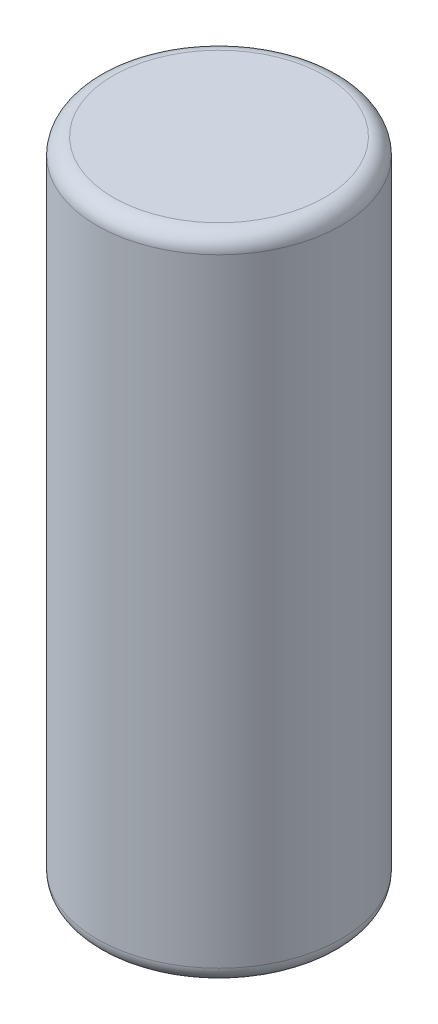
ISO-10303-21;
HEADER;
FILE_DESCRIPTION(('STEP AP214'),'2;1');
FILE_NAME('part.step','',(''),(''),'','','');
FILE_SCHEMA(('AUTOMOTIVE_DESIGN { 1 0 10303 214 1 1 1 1 }'));
ENDSEC;
DATA;
#1=APPLICATION_CONTEXT('core data for automotive mechanical design processes');
#2=APPLICATION_PROTOCOL_DEFINITION('international standard','automotive_design',2000,#1);
#3=PRODUCT_CONTEXT('',#1,'mechanical');
#4=PRODUCT('Part','Part','',(#3));
#5=PRODUCT_RELATED_PRODUCT_CATEGORY('part','',(#4));
#6=PRODUCT_DEFINITION_FORMATION('','',#4);
#7=PRODUCT_DEFINITION_CONTEXT('part definition',#1,'design');
#8=PRODUCT_DEFINITION('design','',#6,#7);
#9=PRODUCT_DEFINITION_SHAPE('','',#8);
#10=(LENGTH_UNIT() NAMED_UNIT(*) SI_UNIT(.MILLI.,.METRE.));
#11=(NAMED_UNIT(*) PLANE_ANGLE_UNIT() SI_UNIT($,.RADIAN.));
#12=(NAMED_UNIT(*) SI_UNIT($,.STERADIAN.) SOLID_ANGLE_UNIT());
#13=UNCERTAINTY_MEASURE_WITH_UNIT(LENGTH_MEASURE(1.E-05),#10,'distance_accuracy_value','');
#14=(GEOMETRIC_REPRESENTATION_CONTEXT(3) GLOBAL_UNCERTAINTY_ASSIGNED_CONTEXT((#13)) GLOBAL_UNIT_ASSIGNED_CONTEXT((#10,
#11,#12)) REPRESENTATION_CONTEXT('',''));
#15=CARTESIAN_POINT('',(0.,0.,0.));
#16=DIRECTION('',(0.,0.,1.));
#17=DIRECTION('',(1.,0.,0.));
#18=AXIS2_PLACEMENT_3D('',#15,#16,#17);
#19=CARTESIAN_POINT('',(0.,400.,0.));
#20=DIRECTION('',(0.,-1.,0.));
#21=DIRECTION('',(0.,0.,-1.));
#22=AXIS2_PLACEMENT_3D('',#19,#20,#21);
#23=CYLINDRICAL_SURFACE('',#22,75.);
#24=CARTESIAN_POINT('',(0.,10.,0.));
#25=DIRECTION('',(0.,1.,0.));
#26=DIRECTION('',(0.,0.,1.));
#27=AXIS2_PLACEMENT_3D('',#24,#25,#26);
#28=CIRCLE('',#27,75.);
#29=CARTESIAN_POINT('',(0.,10.,-75.));
#30=VERTEX_POINT('',#29);
#31=EDGE_CURVE('E44',#30,#30,#28,.T.);
#32=CARTESIAN_POINT('',(0.,390.,0.));
#33=DIRECTION('',(0.,1.,0.));
#34=DIRECTION('',(0.,0.,1.));
#35=AXIS2_PLACEMENT_3D('',#32,#33,#34);
#36=CIRCLE('',#35,75.);
#37=CARTESIAN_POINT('',(0.,390.,-75.));
#38=VERTEX_POINT('',#37);
#39=EDGE_CURVE('E48',#38,#38,#36,.F.);
#40=CARTESIAN_POINT('',(0.,10.,-75.));
#41=CARTESIAN_POINT('',(0.,13.9583333333333,-75.));
#42=CARTESIAN_POINT('',(0.,17.9166666666667,-75.));
#43=CARTESIAN_POINT('',(0.,25.8333333333334,-75.));
#44=CARTESIAN_POINT('',(0.,29.7916666666667,-75.));
#45=CARTESIAN_POINT('',(0.,37.7083333333333,-75.));
#46=CARTESIAN_POINT('',(0.,41.6666666666667,-75.));
#47=CARTESIAN_POINT('',(0.,49.5833333333334,-75.));
#48=CARTESIAN_POINT('',(0.,53.5416666666667,-75.));
#49=CARTESIAN_POINT('',(0.,61.4583333333334,-75.));
#50=CARTESIAN_POINT('',(0.,65.4166666666667,-75.));
#51=CARTESIAN_POINT('',(0.,73.3333333333334,-75.));
#52=CARTESIAN_POINT('',(0.,77.2916666666667,-75.));
#53=CARTESIAN_POINT('',(0.,85.2083333333334,-75.));
#54=CARTESIAN_POINT('',(0.,89.1666666666667,-75.));
#55=CARTESIAN_POINT('',(0.,97.0833333333334,-75.));
#56=CARTESIAN_POINT('',(0.,101.041666666667,-75.));
#57=CARTESIAN_POINT('',(0.,108.958333333333,-75.));
#58=CARTESIAN_POINT('',(0.,112.916666666667,-75.));
#59=CARTESIAN_POINT('',(0.,120.833333333333,-75.));
#60=CARTESIAN_POINT('',(0.,124.791666666667,-75.));
#61=CARTESIAN_POINT('',(0.,132.708333333333,-75.));
#62=CARTESIAN_POINT('',(0.,136.666666666667,-75.));
#63=CARTESIAN_POINT('',(0.,144.583333333333,-75.));
#64=CARTESIAN_POINT('',(0.,148.541666666667,-75.));
#65=CARTESIAN_POINT('',(0.,156.458333333333,-75.));
#66=CARTESIAN_POINT('',(0.,160.416666666667,-75.));
#67=CARTESIAN_POINT('',(0.,168.333333333333,-75.));
#68=CARTESIAN_POINT('',(0.,172.291666666667,-75.));
#69=CARTESIAN_POINT('',(0.,180.208333333333,-75.));
#70=CARTESIAN_POINT('',(0.,184.166666666667,-75.));
#71=CARTESIAN_POINT('',(0.,192.083333333333,-75.));
#72=CARTESIAN_POINT('',(0.,196.041666666667,-75.));
#73=CARTESIAN_POINT('',(0.,203.958333333333,-75.));
#74=CARTESIAN_POINT('',(0.,207.916666666667,-75.));
#75=CARTESIAN_POINT('',(0.,215.833333333333,-75.));
#76=CARTESIAN_POINT('',(0.,219.791666666667,-75.));
#77=CARTESIAN_POINT('',(0.,227.708333333333,-75.));
#78=CARTESIAN_POINT('',(0.,231.666666666667,-75.));
#79=CARTESIAN_POINT('',(0.,239.583333333333,-75.));
#80=CARTESIAN_POINT('',(0.,243.541666666667,-75.));
#81=CARTESIAN_POINT('',(0.,251.458333333333,-75.));
#82=CARTESIAN_POINT('',(0.,255.416666666667,-75.));
#83=CARTESIAN_POINT('',(0.,263.333333333333,-75.));
#84=CARTESIAN_POINT('',(0.,267.291666666667,-75.));
#85=CARTESIAN_POINT('',(0.,275.208333333333,-75.));
#86=CARTESIAN_POINT('',(0.,279.166666666667,-75.));
#87=CARTESIAN_POINT('',(0.,287.083333333333,-75.));
#88=CARTESIAN_POINT('',(0.,291.041666666667,-75.));
#89=CARTESIAN_POINT('',(0.,298.958333333333,-75.));
#90=CARTESIAN_POINT('',(0.,302.916666666667,-75.));
#91=CARTESIAN_POINT('',(0.,310.833333333333,-75.));
#92=CARTESIAN_POINT('',(0.,314.791666666667,-75.));
#93=CARTESIAN_POINT('',(0.,322.708333333333,-75.));
#94=CARTESIAN_POINT('',(0.,326.666666666667,-75.));
#95=CARTESIAN_POINT('',(0.,334.583333333333,-75.));
#96=CARTESIAN_POINT('',(0.,338.541666666667,-75.));
#97=CARTESIAN_POINT('',(0.,346.458333333333,-75.));
#98=CARTESIAN_POINT('',(0.,350.416666666667,-75.));
#99=CARTESIAN_POINT('',(0.,358.333333333333,-75.));
#100=CARTESIAN_POINT('',(0.,362.291666666667,-75.));
#101=CARTESIAN_POINT('',(0.,370.208333333334,-75.));
#102=CARTESIAN_POINT('',(0.,374.166666666667,-75.));
#103=CARTESIAN_POINT('',(0.,382.083333333333,-75.));
#104=CARTESIAN_POINT('',(0.,386.041666666667,-75.));
#105=CARTESIAN_POINT('',(0.,390.,-75.));
#106=B_SPLINE_CURVE_WITH_KNOTS('',3,(#40,#41,#42,#43,#44,#45,#46,#47,#48,#49,#50,#51,#52,#53,
#54,#55,#56,#57,#58,#59,#60,#61,#62,#63,#64,#65,#66,#67,#68,#69,#70,#71,#72,#73,#74,#75,#76,#77,
#78,#79,#80,#81,#82,#83,#84,#85,#86,#87,#88,#89,#90,#91,#92,#93,#94,#95,#96,#97,#98,#99,#100,
#101,#102,#103,#104,#105),.UNSPECIFIED.,.F.,.F.,(4,2,2,2,2,2,2,2,2,2,2,2,2,2,2,2,2,2,2,2,2,2,2,
2,2,2,2,2,2,2,2,2,4),(0.,11.875,23.75,35.625,47.5,59.3750000000001,71.25,83.1250000000001,
95.0000000000001,106.875,118.75,130.625,142.5,154.375,166.25,178.125,190.,201.875,213.75,
225.625,237.5,249.375,261.25,273.125,285.,296.875,308.75,320.625,332.5,344.375,356.25,368.125,
380.),.UNSPECIFIED.);
#107=EDGE_CURVE('BSEAM37',#30,#38,#106,.T.);
#108=ORIENTED_EDGE('',*,*,#31,.T.);
#109=ORIENTED_EDGE('',*,*,#39,.T.);
#110=ORIENTED_EDGE('',*,*,#107,.T.);
#111=ORIENTED_EDGE('',*,*,#107,.F.);
#112=EDGE_LOOP('',(#108,#110,#109,#111));
#113=FACE_BOUND('',#112,.T.);
#114=ADVANCED_FACE('F37',(#113),#23,.T.);
#115=CARTESIAN_POINT('',(0.,400.,0.));
#116=DIRECTION('',(0.,1.,0.));
#117=DIRECTION('',(0.,0.,1.));
#118=AXIS2_PLACEMENT_3D('',#115,#116,#117);
#119=PLANE('',#118);
#120=CARTESIAN_POINT('',(0.,400.,0.));
#121=DIRECTION('',(0.,1.,0.));
#122=DIRECTION('',(0.,0.,1.));
#123=AXIS2_PLACEMENT_3D('',#120,#121,#122);
#124=CIRCLE('',#123,65.);
#125=CARTESIAN_POINT('',(0.,400.,65.));
#126=VERTEX_POINT('',#125);
#127=EDGE_CURVE('E52',#126,#126,#124,.T.);
#128=ORIENTED_EDGE('',*,*,#127,.T.);
#129=EDGE_LOOP('',(#128));
#130=FACE_BOUND('',#129,.T.);
#131=ADVANCED_FACE('F58',(#130),#119,.T.);
#132=CARTESIAN_POINT('',(0.,0.,0.));
#133=DIRECTION('',(0.,1.,0.));
#134=DIRECTION('',(0.,0.,1.));
#135=AXIS2_PLACEMENT_3D('',#132,#133,#134);
#136=PLANE('',#135);
#137=CARTESIAN_POINT('',(0.,0.,0.));
#138=DIRECTION('',(0.,1.,0.));
#139=DIRECTION('',(0.,0.,1.));
#140=AXIS2_PLACEMENT_3D('',#137,#138,#139);
#141=CIRCLE('',#140,65.);
#142=CARTESIAN_POINT('',(0.,0.,65.));
#143=VERTEX_POINT('',#142);
#144=EDGE_CURVE('E10',#143,#143,#141,.F.);
#145=ORIENTED_EDGE('',*,*,#144,.T.);
#146=EDGE_LOOP('',(#145));
#147=FACE_BOUND('',#146,.T.);
#148=ADVANCED_FACE('F62',(#147),#136,.F.);
#149=CARTESIAN_POINT('',(0.,390.,0.));
#150=DIRECTION('',(0.,1.,0.));
#151=DIRECTION('',(0.,0.,1.));
#152=AXIS2_PLACEMENT_3D('',#149,#150,#151);
#153=TOROIDAL_SURFACE('',#152,65.,10.);
#154=ORIENTED_EDGE('',*,*,#39,.F.);
#155=EDGE_LOOP('',(#154));
#156=FACE_BOUND('',#155,.T.);
#157=ORIENTED_EDGE('',*,*,#127,.F.);
#158=EDGE_LOOP('',(#157));
#159=FACE_BOUND('',#158,.T.);
#160=ADVANCED_FACE('F60',(#156,#159),#153,.T.);
#161=CARTESIAN_POINT('',(0.,10.,0.));
#162=DIRECTION('',(0.,1.,0.));
#163=DIRECTION('',(0.,0.,1.));
#164=AXIS2_PLACEMENT_3D('',#161,#162,#163);
#165=TOROIDAL_SURFACE('',#164,65.,10.);
#166=ORIENTED_EDGE('',*,*,#144,.F.);
#167=EDGE_LOOP('',(#166));
#168=FACE_BOUND('',#167,.T.);
#169=ORIENTED_EDGE('',*,*,#31,.F.);
#170=EDGE_LOOP('',(#169));
#171=FACE_BOUND('',#170,.T.);
#172=ADVANCED_FACE('F39',(#168,#171),#165,.T.);
#173=CLOSED_SHELL('',(#114,#131,#148,#160,#172));
#174=MANIFOLD_SOLID_BREP('B2',#173);
#175=ADVANCED_BREP_SHAPE_REPRESENTATION('',(#18,#174),#14);
#176=SHAPE_DEFINITION_REPRESENTATION(#9,#175);
ENDSEC;
END-ISO-10303-21;
